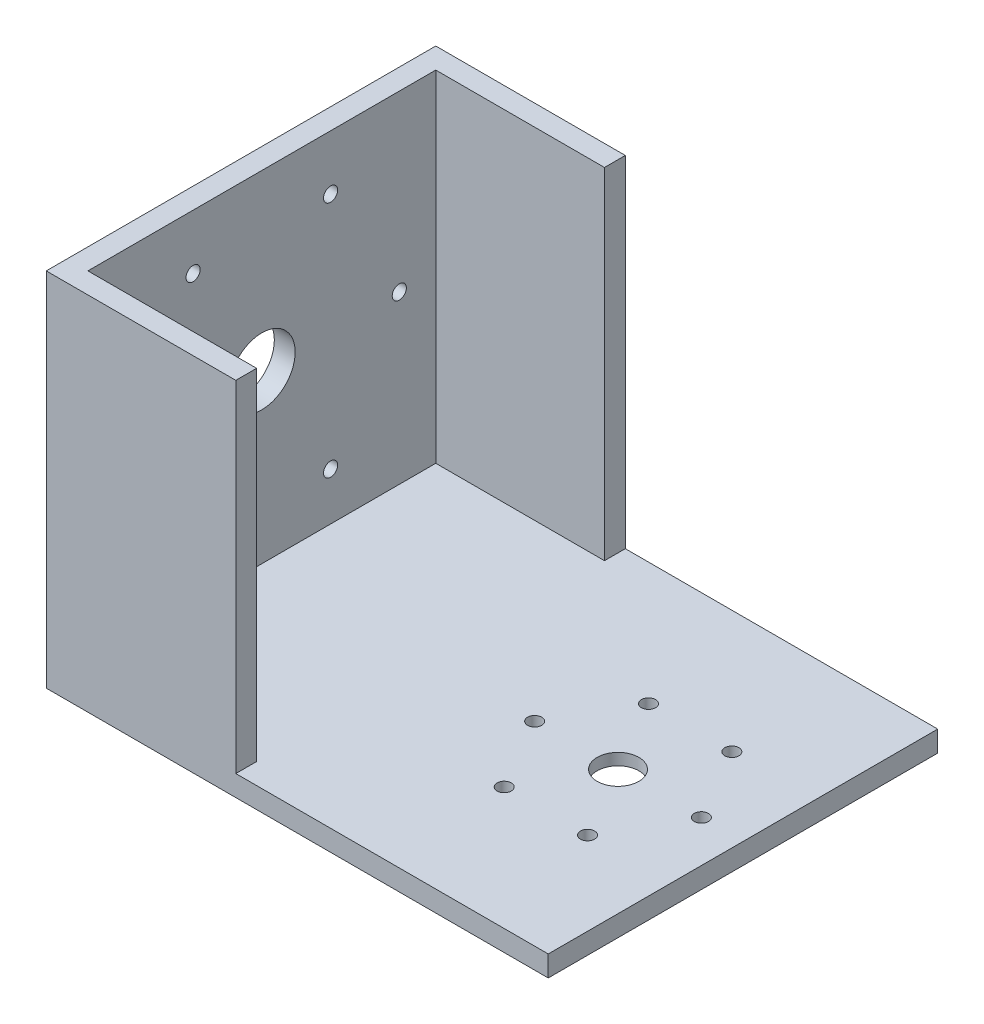
ISO-10303-21;
HEADER;
FILE_DESCRIPTION(('STEP AP214'),'2;1');
FILE_NAME('part.step','',(''),(''),'','','');
FILE_SCHEMA(('AUTOMOTIVE_DESIGN { 1 0 10303 214 1 1 1 1 }'));
ENDSEC;
DATA;
#1=APPLICATION_CONTEXT('core data for automotive mechanical design processes');
#2=APPLICATION_PROTOCOL_DEFINITION('international standard','automotive_design',2000,#1);
#3=PRODUCT_CONTEXT('',#1,'mechanical');
#4=PRODUCT('Part','Part','',(#3));
#5=PRODUCT_RELATED_PRODUCT_CATEGORY('part','',(#4));
#6=PRODUCT_DEFINITION_FORMATION('','',#4);
#7=PRODUCT_DEFINITION_CONTEXT('part definition',#1,'design');
#8=PRODUCT_DEFINITION('design','',#6,#7);
#9=PRODUCT_DEFINITION_SHAPE('','',#8);
#10=(LENGTH_UNIT() NAMED_UNIT(*) SI_UNIT(.MILLI.,.METRE.));
#11=(NAMED_UNIT(*) PLANE_ANGLE_UNIT() SI_UNIT($,.RADIAN.));
#12=(NAMED_UNIT(*) SI_UNIT($,.STERADIAN.) SOLID_ANGLE_UNIT());
#13=UNCERTAINTY_MEASURE_WITH_UNIT(LENGTH_MEASURE(1.E-05),#10,'distance_accuracy_value','');
#14=(GEOMETRIC_REPRESENTATION_CONTEXT(3) GLOBAL_UNCERTAINTY_ASSIGNED_CONTEXT((#13)) GLOBAL_UNIT_ASSIGNED_CONTEXT((#10,
#11,#12)) REPRESENTATION_CONTEXT('',''));
#15=CARTESIAN_POINT('',(0.,0.,0.));
#16=DIRECTION('',(0.,0.,1.));
#17=DIRECTION('',(1.,0.,0.));
#18=AXIS2_PLACEMENT_3D('',#15,#16,#17);
#19=CARTESIAN_POINT('',(0.,5.,0.));
#20=DIRECTION('',(0.,-1.,0.));
#21=DIRECTION('',(0.,0.,-1.));
#22=AXIS2_PLACEMENT_3D('',#19,#20,#21);
#23=PLANE('',#22);
#24=CARTESIAN_POINT('',(20.,5.,0.));
#25=DIRECTION('',(0.,1.,0.));
#26=DIRECTION('',(0.,0.,1.));
#27=AXIS2_PLACEMENT_3D('',#24,#25,#26);
#28=CIRCLE('',#27,1.7);
#29=CARTESIAN_POINT('',(20.,5.,1.7));
#30=VERTEX_POINT('',#29);
#31=EDGE_CURVE('E249',#30,#30,#28,.T.);
#32=ORIENTED_EDGE('',*,*,#31,.F.);
#33=EDGE_LOOP('',(#32));
#34=FACE_BOUND('',#33,.T.);
#35=CARTESIAN_POINT('',(10.,5.,-17.3205080756888));
#36=DIRECTION('',(0.,1.,0.));
#37=DIRECTION('',(0.,0.,1.));
#38=AXIS2_PLACEMENT_3D('',#35,#36,#37);
#39=CIRCLE('',#38,1.7);
#40=CARTESIAN_POINT('',(10.,5.,-15.6205080756888));
#41=VERTEX_POINT('',#40);
#42=EDGE_CURVE('E243',#41,#41,#39,.T.);
#43=ORIENTED_EDGE('',*,*,#42,.F.);
#44=EDGE_LOOP('',(#43));
#45=FACE_BOUND('',#44,.T.);
#46=CARTESIAN_POINT('',(-9.99999999999999,5.,-17.3205080756888));
#47=DIRECTION('',(0.,1.,0.));
#48=DIRECTION('',(0.,0.,1.));
#49=AXIS2_PLACEMENT_3D('',#46,#47,#48);
#50=CIRCLE('',#49,1.7);
#51=CARTESIAN_POINT('',(-9.99999999999999,5.,-15.6205080756888));
#52=VERTEX_POINT('',#51);
#53=EDGE_CURVE('E236',#52,#52,#50,.T.);
#54=ORIENTED_EDGE('',*,*,#53,.F.);
#55=EDGE_LOOP('',(#54));
#56=FACE_BOUND('',#55,.T.);
#57=CARTESIAN_POINT('',(-20.,5.,0.));
#58=DIRECTION('',(0.,1.,0.));
#59=DIRECTION('',(0.,0.,1.));
#60=AXIS2_PLACEMENT_3D('',#57,#58,#59);
#61=CIRCLE('',#60,1.7);
#62=CARTESIAN_POINT('',(-20.,5.,1.7));
#63=VERTEX_POINT('',#62);
#64=EDGE_CURVE('E235',#63,#63,#61,.T.);
#65=ORIENTED_EDGE('',*,*,#64,.F.);
#66=EDGE_LOOP('',(#65));
#67=FACE_BOUND('',#66,.T.);
#68=CARTESIAN_POINT('',(-10.,5.,17.3205080756888));
#69=DIRECTION('',(0.,1.,0.));
#70=DIRECTION('',(0.,0.,1.));
#71=AXIS2_PLACEMENT_3D('',#68,#69,#70);
#72=CIRCLE('',#71,1.7);
#73=CARTESIAN_POINT('',(-10.,5.,19.0205080756888));
#74=VERTEX_POINT('',#73);
#75=EDGE_CURVE('E226',#74,#74,#72,.T.);
#76=ORIENTED_EDGE('',*,*,#75,.F.);
#77=EDGE_LOOP('',(#76));
#78=FACE_BOUND('',#77,.T.);
#79=CARTESIAN_POINT('',(10.,5.,17.3205080756888));
#80=DIRECTION('',(0.,1.,0.));
#81=DIRECTION('',(0.,0.,1.));
#82=AXIS2_PLACEMENT_3D('',#79,#80,#81);
#83=CIRCLE('',#82,1.7);
#84=CARTESIAN_POINT('',(10.,5.,19.0205080756888));
#85=VERTEX_POINT('',#84);
#86=EDGE_CURVE('E219',#85,#85,#83,.T.);
#87=ORIENTED_EDGE('',*,*,#86,.F.);
#88=EDGE_LOOP('',(#87));
#89=FACE_BOUND('',#88,.T.);
#90=CARTESIAN_POINT('',(0.,5.,0.));
#91=DIRECTION('',(0.,1.,0.));
#92=DIRECTION('',(0.,0.,1.));
#93=AXIS2_PLACEMENT_3D('',#90,#91,#92);
#94=CIRCLE('',#93,5.);
#95=CARTESIAN_POINT('',(0.,5.,5.));
#96=VERTEX_POINT('',#95);
#97=EDGE_CURVE('E216',#96,#96,#94,.T.);
#98=ORIENTED_EDGE('',*,*,#97,.F.);
#99=EDGE_LOOP('',(#98));
#100=FACE_BOUND('',#99,.T.);
#101=DIRECTION('',(0.,0.,-1.));
#102=VECTOR('',#101,1.);
#103=CARTESIAN_POINT('',(-45.,5.,0.));
#104=LINE('',#103,#102);
#105=CARTESIAN_POINT('',(-45.,5.,-41.75));
#106=VERTEX_POINT('',#105);
#107=CARTESIAN_POINT('',(-45.,5.,-46.75));
#108=VERTEX_POINT('',#107);
#109=EDGE_CURVE('E53',#106,#108,#104,.T.);
#110=ORIENTED_EDGE('',*,*,#109,.F.);
#111=DIRECTION('',(-1.,0.,0.));
#112=VECTOR('',#111,1.);
#113=CARTESIAN_POINT('',(0.,5.,-41.75));
#114=LINE('',#113,#112);
#115=CARTESIAN_POINT('',(-85.5,5.,-41.75));
#116=VERTEX_POINT('',#115);
#117=EDGE_CURVE('E121',#106,#116,#114,.T.);
#118=ORIENTED_EDGE('',*,*,#117,.T.);
#119=DIRECTION('',(0.,0.,1.));
#120=VECTOR('',#119,1.);
#121=CARTESIAN_POINT('',(-85.5,5.,0.));
#122=LINE('',#121,#120);
#123=CARTESIAN_POINT('',(-85.5,5.,41.75));
#124=VERTEX_POINT('',#123);
#125=EDGE_CURVE('E50',#116,#124,#122,.T.);
#126=ORIENTED_EDGE('',*,*,#125,.T.);
#127=DIRECTION('',(-1.,0.,0.));
#128=VECTOR('',#127,1.);
#129=CARTESIAN_POINT('',(0.,5.,41.75));
#130=LINE('',#129,#128);
#131=CARTESIAN_POINT('',(-45.,5.,41.75));
#132=VERTEX_POINT('',#131);
#133=EDGE_CURVE('E152',#132,#124,#130,.T.);
#134=ORIENTED_EDGE('',*,*,#133,.F.);
#135=DIRECTION('',(0.,0.,-1.));
#136=VECTOR('',#135,1.);
#137=CARTESIAN_POINT('',(-45.,5.,0.));
#138=LINE('',#137,#136);
#139=CARTESIAN_POINT('',(-45.,5.,46.75));
#140=VERTEX_POINT('',#139);
#141=EDGE_CURVE('E160',#140,#132,#138,.T.);
#142=ORIENTED_EDGE('',*,*,#141,.F.);
#143=DIRECTION('',(1.,0.,0.));
#144=VECTOR('',#143,1.);
#145=CARTESIAN_POINT('',(30.,5.,46.75));
#146=LINE('',#145,#144);
#147=CARTESIAN_POINT('',(30.,5.,46.75));
#148=VERTEX_POINT('',#147);
#149=EDGE_CURVE('E258',#140,#148,#146,.T.);
#150=ORIENTED_EDGE('',*,*,#149,.T.);
#151=DIRECTION('',(0.,0.,-1.));
#152=VECTOR('',#151,1.);
#153=CARTESIAN_POINT('',(30.,5.,-46.75));
#154=LINE('',#153,#152);
#155=CARTESIAN_POINT('',(30.,5.,-46.75));
#156=VERTEX_POINT('',#155);
#157=EDGE_CURVE('E256',#148,#156,#154,.T.);
#158=ORIENTED_EDGE('',*,*,#157,.T.);
#159=DIRECTION('',(-1.,0.,0.));
#160=VECTOR('',#159,1.);
#161=CARTESIAN_POINT('',(-90.5,5.,-46.75));
#162=LINE('',#161,#160);
#163=EDGE_CURVE('E56',#156,#108,#162,.T.);
#164=ORIENTED_EDGE('',*,*,#163,.T.);
#165=EDGE_LOOP('',(#110,#118,#126,#134,#142,#150,#158,#164));
#166=FACE_BOUND('',#165,.T.);
#167=ADVANCED_FACE('F39',(#34,#45,#56,#67,#78,#89,#100,#166),#23,.F.);
#168=CARTESIAN_POINT('',(-85.5,0.,0.));
#169=DIRECTION('',(1.,0.,0.));
#170=DIRECTION('',(0.,0.,-1.));
#171=AXIS2_PLACEMENT_3D('',#168,#169,#170);
#172=PLANE('',#171);
#173=DIRECTION('',(0.,-1.,0.));
#174=VECTOR('',#173,1.);
#175=CARTESIAN_POINT('',(-85.5,0.,-41.75));
#176=LINE('',#175,#174);
#177=CARTESIAN_POINT('',(-85.5,86.75,-41.75));
#178=VERTEX_POINT('',#177);
#179=EDGE_CURVE('E135',#178,#116,#176,.T.);
#180=ORIENTED_EDGE('',*,*,#179,.F.);
#181=DIRECTION('',(0.,0.,1.));
#182=VECTOR('',#181,1.);
#183=CARTESIAN_POINT('',(-85.5,86.75,-46.75));
#184=LINE('',#183,#182);
#185=CARTESIAN_POINT('',(-85.5,86.75,41.75));
#186=VERTEX_POINT('',#185);
#187=EDGE_CURVE('E140',#178,#186,#184,.T.);
#188=ORIENTED_EDGE('',*,*,#187,.T.);
#189=DIRECTION('',(0.,-1.,0.));
#190=VECTOR('',#189,1.);
#191=CARTESIAN_POINT('',(-85.5,0.,41.75));
#192=LINE('',#191,#190);
#193=EDGE_CURVE('E11',#186,#124,#192,.T.);
#194=ORIENTED_EDGE('',*,*,#193,.T.);
#195=ORIENTED_EDGE('',*,*,#125,.F.);
#196=EDGE_LOOP('',(#180,#188,#194,#195));
#197=FACE_BOUND('',#196,.T.);
#198=CARTESIAN_POINT('',(-85.5,16.4211616751135,-16.5));
#199=DIRECTION('',(1.,0.,0.));
#200=DIRECTION('',(0.,0.,-1.));
#201=AXIS2_PLACEMENT_3D('',#198,#199,#200);
#202=CIRCLE('',#201,1.7);
#203=CARTESIAN_POINT('',(-85.5,16.4211616751135,-18.2));
#204=VERTEX_POINT('',#203);
#205=EDGE_CURVE('E159',#204,#204,#202,.T.);
#206=ORIENTED_EDGE('',*,*,#205,.F.);
#207=EDGE_LOOP('',(#206));
#208=FACE_BOUND('',#207,.T.);
#209=CARTESIAN_POINT('',(-85.5,45.,33.));
#210=DIRECTION('',(1.,0.,0.));
#211=DIRECTION('',(0.,0.,-1.));
#212=AXIS2_PLACEMENT_3D('',#209,#210,#211);
#213=CIRCLE('',#212,1.7);
#214=CARTESIAN_POINT('',(-85.5,45.,31.3));
#215=VERTEX_POINT('',#214);
#216=EDGE_CURVE('E175',#215,#215,#213,.T.);
#217=ORIENTED_EDGE('',*,*,#216,.F.);
#218=EDGE_LOOP('',(#217));
#219=FACE_BOUND('',#218,.T.);
#220=CARTESIAN_POINT('',(-85.5,73.5788383248865,-16.5));
#221=DIRECTION('',(1.,0.,0.));
#222=DIRECTION('',(0.,0.,-1.));
#223=AXIS2_PLACEMENT_3D('',#220,#221,#222);
#224=CIRCLE('',#223,1.7);
#225=CARTESIAN_POINT('',(-85.5,73.5788383248865,-18.2));
#226=VERTEX_POINT('',#225);
#227=EDGE_CURVE('E184',#226,#226,#224,.T.);
#228=ORIENTED_EDGE('',*,*,#227,.F.);
#229=EDGE_LOOP('',(#228));
#230=FACE_BOUND('',#229,.T.);
#231=CARTESIAN_POINT('',(-85.5,45.,0.));
#232=DIRECTION('',(1.,0.,0.));
#233=DIRECTION('',(0.,0.,-1.));
#234=AXIS2_PLACEMENT_3D('',#231,#232,#233);
#235=CIRCLE('',#234,8.);
#236=CARTESIAN_POINT('',(-85.5,45.,-8.));
#237=VERTEX_POINT('',#236);
#238=EDGE_CURVE('E198',#237,#237,#235,.T.);
#239=ORIENTED_EDGE('',*,*,#238,.F.);
#240=EDGE_LOOP('',(#239));
#241=FACE_BOUND('',#240,.T.);
#242=CARTESIAN_POINT('',(-85.5,45.,-33.));
#243=DIRECTION('',(1.,0.,0.));
#244=DIRECTION('',(0.,0.,-1.));
#245=AXIS2_PLACEMENT_3D('',#242,#243,#244);
#246=CIRCLE('',#245,1.7);
#247=CARTESIAN_POINT('',(-85.5,45.,-34.7));
#248=VERTEX_POINT('',#247);
#249=EDGE_CURVE('E189',#248,#248,#246,.T.);
#250=ORIENTED_EDGE('',*,*,#249,.F.);
#251=EDGE_LOOP('',(#250));
#252=FACE_BOUND('',#251,.T.);
#253=CARTESIAN_POINT('',(-85.5,73.5788383248865,16.5));
#254=DIRECTION('',(1.,0.,0.));
#255=DIRECTION('',(0.,0.,-1.));
#256=AXIS2_PLACEMENT_3D('',#253,#254,#255);
#257=CIRCLE('',#256,1.7);
#258=CARTESIAN_POINT('',(-85.5,73.5788383248865,14.8));
#259=VERTEX_POINT('',#258);
#260=EDGE_CURVE('E177',#259,#259,#257,.T.);
#261=ORIENTED_EDGE('',*,*,#260,.F.);
#262=EDGE_LOOP('',(#261));
#263=FACE_BOUND('',#262,.T.);
#264=CARTESIAN_POINT('',(-85.5,16.4211616751135,16.5));
#265=DIRECTION('',(1.,0.,0.));
#266=DIRECTION('',(0.,0.,-1.));
#267=AXIS2_PLACEMENT_3D('',#264,#265,#266);
#268=CIRCLE('',#267,1.7);
#269=CARTESIAN_POINT('',(-85.5,16.4211616751135,14.8));
#270=VERTEX_POINT('',#269);
#271=EDGE_CURVE('E167',#270,#270,#268,.T.);
#272=ORIENTED_EDGE('',*,*,#271,.F.);
#273=EDGE_LOOP('',(#272));
#274=FACE_BOUND('',#273,.T.);
#275=ADVANCED_FACE('F288',(#197,#208,#219,#230,#241,#252,#263,#274),#172,.T.);
#276=CARTESIAN_POINT('',(0.,0.,0.));
#277=DIRECTION('',(0.,-1.,0.));
#278=DIRECTION('',(0.,0.,-1.));
#279=AXIS2_PLACEMENT_3D('',#276,#277,#278);
#280=PLANE('',#279);
#281=DIRECTION('',(0.,0.,1.));
#282=VECTOR('',#281,1.);
#283=CARTESIAN_POINT('',(-90.5,0.,46.75));
#284=LINE('',#283,#282);
#285=CARTESIAN_POINT('',(-90.5,0.,-46.75));
#286=VERTEX_POINT('',#285);
#287=CARTESIAN_POINT('',(-90.5,0.,46.75));
#288=VERTEX_POINT('',#287);
#289=EDGE_CURVE('E251',#286,#288,#284,.T.);
#290=ORIENTED_EDGE('',*,*,#289,.F.);
#291=DIRECTION('',(-1.,0.,0.));
#292=VECTOR('',#291,1.);
#293=CARTESIAN_POINT('',(-90.5,0.,-46.75));
#294=LINE('',#293,#292);
#295=CARTESIAN_POINT('',(30.,0.,-46.75));
#296=VERTEX_POINT('',#295);
#297=EDGE_CURVE('E259',#296,#286,#294,.T.);
#298=ORIENTED_EDGE('',*,*,#297,.F.);
#299=DIRECTION('',(0.,0.,-1.));
#300=VECTOR('',#299,1.);
#301=CARTESIAN_POINT('',(30.,0.,-46.75));
#302=LINE('',#301,#300);
#303=CARTESIAN_POINT('',(30.,0.,46.75));
#304=VERTEX_POINT('',#303);
#305=EDGE_CURVE('E266',#304,#296,#302,.T.);
#306=ORIENTED_EDGE('',*,*,#305,.F.);
#307=DIRECTION('',(1.,0.,0.));
#308=VECTOR('',#307,1.);
#309=CARTESIAN_POINT('',(30.,0.,46.75));
#310=LINE('',#309,#308);
#311=EDGE_CURVE('E262',#288,#304,#310,.T.);
#312=ORIENTED_EDGE('',*,*,#311,.F.);
#313=EDGE_LOOP('',(#290,#298,#306,#312));
#314=FACE_BOUND('',#313,.T.);
#315=CARTESIAN_POINT('',(0.,0.,0.));
#316=DIRECTION('',(0.,1.,0.));
#317=DIRECTION('',(0.,0.,1.));
#318=AXIS2_PLACEMENT_3D('',#315,#316,#317);
#319=CIRCLE('',#318,15.15);
#320=CARTESIAN_POINT('',(0.,0.,15.15));
#321=VERTEX_POINT('',#320);
#322=EDGE_CURVE('E207',#321,#321,#319,.T.);
#323=ORIENTED_EDGE('',*,*,#322,.T.);
#324=EDGE_LOOP('',(#323));
#325=FACE_BOUND('',#324,.T.);
#326=CARTESIAN_POINT('',(10.,0.,17.3205080756888));
#327=DIRECTION('',(0.,1.,0.));
#328=DIRECTION('',(0.,0.,1.));
#329=AXIS2_PLACEMENT_3D('',#326,#327,#328);
#330=CIRCLE('',#329,1.7);
#331=CARTESIAN_POINT('',(10.,0.,19.0205080756888));
#332=VERTEX_POINT('',#331);
#333=EDGE_CURVE('E218',#332,#332,#330,.T.);
#334=ORIENTED_EDGE('',*,*,#333,.T.);
#335=EDGE_LOOP('',(#334));
#336=FACE_BOUND('',#335,.T.);
#337=CARTESIAN_POINT('',(-20.,0.,0.));
#338=DIRECTION('',(0.,1.,0.));
#339=DIRECTION('',(0.,0.,1.));
#340=AXIS2_PLACEMENT_3D('',#337,#338,#339);
#341=CIRCLE('',#340,1.7);
#342=CARTESIAN_POINT('',(-20.,0.,1.7));
#343=VERTEX_POINT('',#342);
#344=EDGE_CURVE('E228',#343,#343,#341,.T.);
#345=ORIENTED_EDGE('',*,*,#344,.T.);
#346=EDGE_LOOP('',(#345));
#347=FACE_BOUND('',#346,.T.);
#348=CARTESIAN_POINT('',(10.,0.,-17.3205080756888));
#349=DIRECTION('',(0.,1.,0.));
#350=DIRECTION('',(0.,0.,1.));
#351=AXIS2_PLACEMENT_3D('',#348,#349,#350);
#352=CIRCLE('',#351,1.7);
#353=CARTESIAN_POINT('',(10.,0.,-15.6205080756888));
#354=VERTEX_POINT('',#353);
#355=EDGE_CURVE('E241',#354,#354,#352,.T.);
#356=ORIENTED_EDGE('',*,*,#355,.T.);
#357=EDGE_LOOP('',(#356));
#358=FACE_BOUND('',#357,.T.);
#359=CARTESIAN_POINT('',(20.,0.,0.));
#360=DIRECTION('',(0.,1.,0.));
#361=DIRECTION('',(0.,0.,1.));
#362=AXIS2_PLACEMENT_3D('',#359,#360,#361);
#363=CIRCLE('',#362,1.7);
#364=CARTESIAN_POINT('',(20.,0.,1.7));
#365=VERTEX_POINT('',#364);
#366=EDGE_CURVE('E250',#365,#365,#363,.T.);
#367=ORIENTED_EDGE('',*,*,#366,.T.);
#368=EDGE_LOOP('',(#367));
#369=FACE_BOUND('',#368,.T.);
#370=CARTESIAN_POINT('',(-9.99999999999999,0.,-17.3205080756888));
#371=DIRECTION('',(0.,1.,0.));
#372=DIRECTION('',(0.,0.,1.));
#373=AXIS2_PLACEMENT_3D('',#370,#371,#372);
#374=CIRCLE('',#373,1.7);
#375=CARTESIAN_POINT('',(-9.99999999999999,0.,-15.6205080756888));
#376=VERTEX_POINT('',#375);
#377=EDGE_CURVE('E234',#376,#376,#374,.T.);
#378=ORIENTED_EDGE('',*,*,#377,.T.);
#379=EDGE_LOOP('',(#378));
#380=FACE_BOUND('',#379,.T.);
#381=CARTESIAN_POINT('',(-10.,0.,17.3205080756888));
#382=DIRECTION('',(0.,1.,0.));
#383=DIRECTION('',(0.,0.,1.));
#384=AXIS2_PLACEMENT_3D('',#381,#382,#383);
#385=CIRCLE('',#384,1.7);
#386=CARTESIAN_POINT('',(-10.,0.,19.0205080756888));
#387=VERTEX_POINT('',#386);
#388=EDGE_CURVE('E224',#387,#387,#385,.T.);
#389=ORIENTED_EDGE('',*,*,#388,.T.);
#390=EDGE_LOOP('',(#389));
#391=FACE_BOUND('',#390,.T.);
#392=ADVANCED_FACE('F295',(#314,#325,#336,#347,#358,#369,#380,#391),#280,.T.);
#393=CARTESIAN_POINT('',(-90.5,5.,46.75));
#394=DIRECTION('',(1.,0.,0.));
#395=DIRECTION('',(0.,0.,-1.));
#396=AXIS2_PLACEMENT_3D('',#393,#394,#395);
#397=PLANE('',#396);
#398=DIRECTION('',(0.,-1.,0.));
#399=VECTOR('',#398,1.);
#400=CARTESIAN_POINT('',(-90.5,5.,46.75));
#401=LINE('',#400,#399);
#402=CARTESIAN_POINT('',(-90.5,86.75,46.75));
#403=VERTEX_POINT('',#402);
#404=EDGE_CURVE('E280',#403,#288,#401,.T.);
#405=ORIENTED_EDGE('',*,*,#404,.F.);
#406=DIRECTION('',(0.,0.,1.));
#407=VECTOR('',#406,1.);
#408=CARTESIAN_POINT('',(-90.5,86.75,-46.75));
#409=LINE('',#408,#407);
#410=CARTESIAN_POINT('',(-90.5,86.75,-46.75));
#411=VERTEX_POINT('',#410);
#412=EDGE_CURVE('E200',#411,#403,#409,.T.);
#413=ORIENTED_EDGE('',*,*,#412,.F.);
#414=DIRECTION('',(0.,-1.,0.));
#415=VECTOR('',#414,1.);
#416=CARTESIAN_POINT('',(-90.5,5.,-46.75));
#417=LINE('',#416,#415);
#418=EDGE_CURVE('E265',#411,#286,#417,.T.);
#419=ORIENTED_EDGE('',*,*,#418,.T.);
#420=ORIENTED_EDGE('',*,*,#289,.T.);
#421=EDGE_LOOP('',(#405,#413,#419,#420));
#422=FACE_BOUND('',#421,.T.);
#423=CARTESIAN_POINT('',(-90.5,16.4211616751135,-16.5));
#424=DIRECTION('',(1.,0.,0.));
#425=DIRECTION('',(0.,0.,-1.));
#426=AXIS2_PLACEMENT_3D('',#423,#424,#425);
#427=CIRCLE('',#426,1.7);
#428=CARTESIAN_POINT('',(-90.5,16.4211616751135,-18.2));
#429=VERTEX_POINT('',#428);
#430=EDGE_CURVE('E157',#429,#429,#427,.T.);
#431=ORIENTED_EDGE('',*,*,#430,.T.);
#432=EDGE_LOOP('',(#431));
#433=FACE_BOUND('',#432,.T.);
#434=CARTESIAN_POINT('',(-90.5,16.4211616751135,16.5));
#435=DIRECTION('',(1.,0.,0.));
#436=DIRECTION('',(0.,0.,-1.));
#437=AXIS2_PLACEMENT_3D('',#434,#435,#436);
#438=CIRCLE('',#437,1.7);
#439=CARTESIAN_POINT('',(-90.5,16.4211616751135,14.8));
#440=VERTEX_POINT('',#439);
#441=EDGE_CURVE('E162',#440,#440,#438,.T.);
#442=ORIENTED_EDGE('',*,*,#441,.T.);
#443=EDGE_LOOP('',(#442));
#444=FACE_BOUND('',#443,.T.);
#445=CARTESIAN_POINT('',(-90.5,45.,33.));
#446=DIRECTION('',(1.,0.,0.));
#447=DIRECTION('',(0.,0.,-1.));
#448=AXIS2_PLACEMENT_3D('',#445,#446,#447);
#449=CIRCLE('',#448,1.7);
#450=CARTESIAN_POINT('',(-90.5,45.,31.3));
#451=VERTEX_POINT('',#450);
#452=EDGE_CURVE('E166',#451,#451,#449,.T.);
#453=ORIENTED_EDGE('',*,*,#452,.T.);
#454=EDGE_LOOP('',(#453));
#455=FACE_BOUND('',#454,.T.);
#456=CARTESIAN_POINT('',(-90.5,73.5788383248865,16.5));
#457=DIRECTION('',(1.,0.,0.));
#458=DIRECTION('',(0.,0.,-1.));
#459=AXIS2_PLACEMENT_3D('',#456,#457,#458);
#460=CIRCLE('',#459,1.7);
#461=CARTESIAN_POINT('',(-90.5,73.5788383248865,14.8));
#462=VERTEX_POINT('',#461);
#463=EDGE_CURVE('E174',#462,#462,#460,.T.);
#464=ORIENTED_EDGE('',*,*,#463,.T.);
#465=EDGE_LOOP('',(#464));
#466=FACE_BOUND('',#465,.T.);
#467=CARTESIAN_POINT('',(-90.5,73.5788383248865,-16.5));
#468=DIRECTION('',(1.,0.,0.));
#469=DIRECTION('',(0.,0.,-1.));
#470=AXIS2_PLACEMENT_3D('',#467,#468,#469);
#471=CIRCLE('',#470,1.7);
#472=CARTESIAN_POINT('',(-90.5,73.5788383248865,-18.2));
#473=VERTEX_POINT('',#472);
#474=EDGE_CURVE('E182',#473,#473,#471,.T.);
#475=ORIENTED_EDGE('',*,*,#474,.T.);
#476=EDGE_LOOP('',(#475));
#477=FACE_BOUND('',#476,.T.);
#478=CARTESIAN_POINT('',(-90.5,45.,-33.));
#479=DIRECTION('',(1.,0.,0.));
#480=DIRECTION('',(0.,0.,-1.));
#481=AXIS2_PLACEMENT_3D('',#478,#479,#480);
#482=CIRCLE('',#481,1.7);
#483=CARTESIAN_POINT('',(-90.5,45.,-34.7));
#484=VERTEX_POINT('',#483);
#485=EDGE_CURVE('E190',#484,#484,#482,.T.);
#486=ORIENTED_EDGE('',*,*,#485,.T.);
#487=EDGE_LOOP('',(#486));
#488=FACE_BOUND('',#487,.T.);
#489=CARTESIAN_POINT('',(-90.5,45.,0.));
#490=DIRECTION('',(1.,0.,0.));
#491=DIRECTION('',(0.,0.,-1.));
#492=AXIS2_PLACEMENT_3D('',#489,#490,#491);
#493=CIRCLE('',#492,8.);
#494=CARTESIAN_POINT('',(-90.5,45.,-8.));
#495=VERTEX_POINT('',#494);
#496=EDGE_CURVE('E192',#495,#495,#493,.T.);
#497=ORIENTED_EDGE('',*,*,#496,.T.);
#498=EDGE_LOOP('',(#497));
#499=FACE_BOUND('',#498,.T.);
#500=ADVANCED_FACE('F41',(#422,#433,#444,#455,#466,#477,#488,#499),#397,.F.);
#501=CARTESIAN_POINT('',(30.,5.,46.75));
#502=DIRECTION('',(0.,0.,-1.));
#503=DIRECTION('',(-1.,0.,0.));
#504=AXIS2_PLACEMENT_3D('',#501,#502,#503);
#505=PLANE('',#504);
#506=ORIENTED_EDGE('',*,*,#149,.F.);
#507=DIRECTION('',(0.,1.,0.));
#508=VECTOR('',#507,1.);
#509=CARTESIAN_POINT('',(-45.,0.,46.75));
#510=LINE('',#509,#508);
#511=CARTESIAN_POINT('',(-45.,86.75,46.75));
#512=VERTEX_POINT('',#511);
#513=EDGE_CURVE('E144',#140,#512,#510,.T.);
#514=ORIENTED_EDGE('',*,*,#513,.T.);
#515=DIRECTION('',(-1.,0.,0.));
#516=VECTOR('',#515,1.);
#517=CARTESIAN_POINT('',(-85.5,86.75,46.75));
#518=LINE('',#517,#516);
#519=EDGE_CURVE('E201',#512,#403,#518,.T.);
#520=ORIENTED_EDGE('',*,*,#519,.T.);
#521=ORIENTED_EDGE('',*,*,#404,.T.);
#522=ORIENTED_EDGE('',*,*,#311,.T.);
#523=DIRECTION('',(0.,-1.,0.));
#524=VECTOR('',#523,1.);
#525=CARTESIAN_POINT('',(30.,5.,46.75));
#526=LINE('',#525,#524);
#527=EDGE_CURVE('E273',#148,#304,#526,.T.);
#528=ORIENTED_EDGE('',*,*,#527,.F.);
#529=EDGE_LOOP('',(#506,#514,#520,#521,#522,#528));
#530=FACE_BOUND('',#529,.T.);
#531=ADVANCED_FACE('F318',(#530),#505,.F.);
#532=CARTESIAN_POINT('',(30.,5.,-46.75));
#533=DIRECTION('',(-1.,0.,0.));
#534=DIRECTION('',(0.,0.,1.));
#535=AXIS2_PLACEMENT_3D('',#532,#533,#534);
#536=PLANE('',#535);
#537=ORIENTED_EDGE('',*,*,#305,.T.);
#538=DIRECTION('',(0.,-1.,0.));
#539=VECTOR('',#538,1.);
#540=CARTESIAN_POINT('',(30.,5.,-46.75));
#541=LINE('',#540,#539);
#542=EDGE_CURVE('E271',#156,#296,#541,.T.);
#543=ORIENTED_EDGE('',*,*,#542,.F.);
#544=ORIENTED_EDGE('',*,*,#157,.F.);
#545=ORIENTED_EDGE('',*,*,#527,.T.);
#546=EDGE_LOOP('',(#537,#543,#544,#545));
#547=FACE_BOUND('',#546,.T.);
#548=ADVANCED_FACE('F361',(#547),#536,.F.);
#549=CARTESIAN_POINT('',(-90.5,5.,-46.75));
#550=DIRECTION('',(0.,0.,1.));
#551=DIRECTION('',(1.,0.,0.));
#552=AXIS2_PLACEMENT_3D('',#549,#550,#551);
#553=PLANE('',#552);
#554=DIRECTION('',(-1.,0.,0.));
#555=VECTOR('',#554,1.);
#556=CARTESIAN_POINT('',(-85.5,86.75,-46.75));
#557=LINE('',#556,#555);
#558=CARTESIAN_POINT('',(-45.,86.75,-46.75));
#559=VERTEX_POINT('',#558);
#560=EDGE_CURVE('E210',#559,#411,#557,.T.);
#561=ORIENTED_EDGE('',*,*,#560,.F.);
#562=DIRECTION('',(0.,1.,0.));
#563=VECTOR('',#562,1.);
#564=CARTESIAN_POINT('',(-45.,0.,-46.75));
#565=LINE('',#564,#563);
#566=EDGE_CURVE('E122',#108,#559,#565,.T.);
#567=ORIENTED_EDGE('',*,*,#566,.F.);
#568=ORIENTED_EDGE('',*,*,#163,.F.);
#569=ORIENTED_EDGE('',*,*,#542,.T.);
#570=ORIENTED_EDGE('',*,*,#297,.T.);
#571=ORIENTED_EDGE('',*,*,#418,.F.);
#572=EDGE_LOOP('',(#561,#567,#568,#569,#570,#571));
#573=FACE_BOUND('',#572,.T.);
#574=ADVANCED_FACE('F359',(#573),#553,.F.);
#575=CARTESIAN_POINT('',(20.,5.,0.));
#576=DIRECTION('',(0.,-1.,0.));
#577=DIRECTION('',(0.,0.,-1.));
#578=AXIS2_PLACEMENT_3D('',#575,#576,#577);
#579=CYLINDRICAL_SURFACE('',#578,1.7);
#580=ORIENTED_EDGE('',*,*,#31,.T.);
#581=EDGE_LOOP('',(#580));
#582=FACE_BOUND('',#581,.T.);
#583=ORIENTED_EDGE('',*,*,#366,.F.);
#584=EDGE_LOOP('',(#583));
#585=FACE_BOUND('',#584,.T.);
#586=ADVANCED_FACE('F354',(#582,#585),#579,.F.);
#587=CARTESIAN_POINT('',(10.,5.,-17.3205080756888));
#588=DIRECTION('',(0.,-1.,0.));
#589=DIRECTION('',(0.,0.,-1.));
#590=AXIS2_PLACEMENT_3D('',#587,#588,#589);
#591=CYLINDRICAL_SURFACE('',#590,1.7);
#592=ORIENTED_EDGE('',*,*,#42,.T.);
#593=EDGE_LOOP('',(#592));
#594=FACE_BOUND('',#593,.T.);
#595=ORIENTED_EDGE('',*,*,#355,.F.);
#596=EDGE_LOOP('',(#595));
#597=FACE_BOUND('',#596,.T.);
#598=ADVANCED_FACE('F423',(#594,#597),#591,.F.);
#599=CARTESIAN_POINT('',(-9.99999999999999,5.,-17.3205080756888));
#600=DIRECTION('',(0.,-1.,0.));
#601=DIRECTION('',(0.,0.,-1.));
#602=AXIS2_PLACEMENT_3D('',#599,#600,#601);
#603=CYLINDRICAL_SURFACE('',#602,1.7);
#604=ORIENTED_EDGE('',*,*,#53,.T.);
#605=EDGE_LOOP('',(#604));
#606=FACE_BOUND('',#605,.T.);
#607=ORIENTED_EDGE('',*,*,#377,.F.);
#608=EDGE_LOOP('',(#607));
#609=FACE_BOUND('',#608,.T.);
#610=ADVANCED_FACE('F414',(#606,#609),#603,.F.);
#611=CARTESIAN_POINT('',(-20.,5.,0.));
#612=DIRECTION('',(0.,-1.,0.));
#613=DIRECTION('',(0.,0.,-1.));
#614=AXIS2_PLACEMENT_3D('',#611,#612,#613);
#615=CYLINDRICAL_SURFACE('',#614,1.7);
#616=ORIENTED_EDGE('',*,*,#64,.T.);
#617=EDGE_LOOP('',(#616));
#618=FACE_BOUND('',#617,.T.);
#619=ORIENTED_EDGE('',*,*,#344,.F.);
#620=EDGE_LOOP('',(#619));
#621=FACE_BOUND('',#620,.T.);
#622=ADVANCED_FACE('F403',(#618,#621),#615,.F.);
#623=CARTESIAN_POINT('',(-10.,5.,17.3205080756888));
#624=DIRECTION('',(0.,-1.,0.));
#625=DIRECTION('',(0.,0.,-1.));
#626=AXIS2_PLACEMENT_3D('',#623,#624,#625);
#627=CYLINDRICAL_SURFACE('',#626,1.7);
#628=ORIENTED_EDGE('',*,*,#75,.T.);
#629=EDGE_LOOP('',(#628));
#630=FACE_BOUND('',#629,.T.);
#631=ORIENTED_EDGE('',*,*,#388,.F.);
#632=EDGE_LOOP('',(#631));
#633=FACE_BOUND('',#632,.T.);
#634=ADVANCED_FACE('F405',(#630,#633),#627,.F.);
#635=CARTESIAN_POINT('',(10.,5.,17.3205080756888));
#636=DIRECTION('',(0.,-1.,0.));
#637=DIRECTION('',(0.,0.,-1.));
#638=AXIS2_PLACEMENT_3D('',#635,#636,#637);
#639=CYLINDRICAL_SURFACE('',#638,1.7);
#640=ORIENTED_EDGE('',*,*,#86,.T.);
#641=EDGE_LOOP('',(#640));
#642=FACE_BOUND('',#641,.T.);
#643=ORIENTED_EDGE('',*,*,#333,.F.);
#644=EDGE_LOOP('',(#643));
#645=FACE_BOUND('',#644,.T.);
#646=ADVANCED_FACE('F404',(#642,#645),#639,.F.);
#647=CARTESIAN_POINT('',(0.,5.,0.));
#648=DIRECTION('',(0.,-1.,0.));
#649=DIRECTION('',(0.,0.,-1.));
#650=AXIS2_PLACEMENT_3D('',#647,#648,#649);
#651=CYLINDRICAL_SURFACE('',#650,5.);
#652=CARTESIAN_POINT('',(0.,2.2,0.));
#653=DIRECTION('',(0.,1.,0.));
#654=DIRECTION('',(0.,0.,1.));
#655=AXIS2_PLACEMENT_3D('',#652,#653,#654);
#656=CIRCLE('',#655,5.);
#657=CARTESIAN_POINT('',(0.,2.2,5.));
#658=VERTEX_POINT('',#657);
#659=EDGE_CURVE('E213',#658,#658,#656,.T.);
#660=ORIENTED_EDGE('',*,*,#659,.F.);
#661=EDGE_LOOP('',(#660));
#662=FACE_BOUND('',#661,.T.);
#663=ORIENTED_EDGE('',*,*,#97,.T.);
#664=EDGE_LOOP('',(#663));
#665=FACE_BOUND('',#664,.T.);
#666=ADVANCED_FACE('F415',(#662,#665),#651,.F.);
#667=CARTESIAN_POINT('',(0.,2.2,0.));
#668=DIRECTION('',(0.,-1.,0.));
#669=DIRECTION('',(0.,0.,-1.));
#670=AXIS2_PLACEMENT_3D('',#667,#668,#669);
#671=CYLINDRICAL_SURFACE('',#670,15.15);
#672=CARTESIAN_POINT('',(0.,2.2,0.));
#673=DIRECTION('',(0.,1.,0.));
#674=DIRECTION('',(0.,0.,1.));
#675=AXIS2_PLACEMENT_3D('',#672,#673,#674);
#676=CIRCLE('',#675,15.15);
#677=CARTESIAN_POINT('',(0.,2.2,15.15));
#678=VERTEX_POINT('',#677);
#679=EDGE_CURVE('E209',#678,#678,#676,.T.);
#680=ORIENTED_EDGE('',*,*,#679,.T.);
#681=EDGE_LOOP('',(#680));
#682=FACE_BOUND('',#681,.T.);
#683=ORIENTED_EDGE('',*,*,#322,.F.);
#684=EDGE_LOOP('',(#683));
#685=FACE_BOUND('',#684,.T.);
#686=ADVANCED_FACE('F444',(#682,#685),#671,.F.);
#687=CARTESIAN_POINT('',(0.,2.2,0.));
#688=DIRECTION('',(0.,1.,0.));
#689=DIRECTION('',(0.,0.,1.));
#690=AXIS2_PLACEMENT_3D('',#687,#688,#689);
#691=PLANE('',#690);
#692=ORIENTED_EDGE('',*,*,#659,.T.);
#693=EDGE_LOOP('',(#692));
#694=FACE_BOUND('',#693,.T.);
#695=ORIENTED_EDGE('',*,*,#679,.F.);
#696=EDGE_LOOP('',(#695));
#697=FACE_BOUND('',#696,.T.);
#698=ADVANCED_FACE('F342',(#694,#697),#691,.F.);
#699=CARTESIAN_POINT('',(-85.5,86.75,-46.75));
#700=DIRECTION('',(0.,-1.,0.));
#701=DIRECTION('',(0.,0.,-1.));
#702=AXIS2_PLACEMENT_3D('',#699,#700,#701);
#703=PLANE('',#702);
#704=ORIENTED_EDGE('',*,*,#187,.F.);
#705=DIRECTION('',(-1.,0.,0.));
#706=VECTOR('',#705,1.);
#707=CARTESIAN_POINT('',(-45.,86.75,-41.75));
#708=LINE('',#707,#706);
#709=CARTESIAN_POINT('',(-45.,86.75,-41.75));
#710=VERTEX_POINT('',#709);
#711=EDGE_CURVE('E119',#710,#178,#708,.T.);
#712=ORIENTED_EDGE('',*,*,#711,.F.);
#713=DIRECTION('',(0.,0.,-1.));
#714=VECTOR('',#713,1.);
#715=CARTESIAN_POINT('',(-45.,86.75,-41.75));
#716=LINE('',#715,#714);
#717=EDGE_CURVE('E130',#710,#559,#716,.T.);
#718=ORIENTED_EDGE('',*,*,#717,.T.);
#719=ORIENTED_EDGE('',*,*,#560,.T.);
#720=ORIENTED_EDGE('',*,*,#412,.T.);
#721=ORIENTED_EDGE('',*,*,#519,.F.);
#722=DIRECTION('',(0.,0.,-1.));
#723=VECTOR('',#722,1.);
#724=CARTESIAN_POINT('',(-45.,86.75,46.75));
#725=LINE('',#724,#723);
#726=CARTESIAN_POINT('',(-45.,86.75,41.75));
#727=VERTEX_POINT('',#726);
#728=EDGE_CURVE('E146',#512,#727,#725,.T.);
#729=ORIENTED_EDGE('',*,*,#728,.T.);
#730=DIRECTION('',(-1.,0.,0.));
#731=VECTOR('',#730,1.);
#732=CARTESIAN_POINT('',(-45.,86.75,41.75));
#733=LINE('',#732,#731);
#734=EDGE_CURVE('E149',#727,#186,#733,.T.);
#735=ORIENTED_EDGE('',*,*,#734,.T.);
#736=EDGE_LOOP('',(#704,#712,#718,#719,#720,#721,#729,#735));
#737=FACE_BOUND('',#736,.T.);
#738=ADVANCED_FACE('F134',(#737),#703,.F.);
#739=CARTESIAN_POINT('',(-85.5,45.,0.));
#740=DIRECTION('',(-1.,0.,0.));
#741=DIRECTION('',(0.,0.,1.));
#742=AXIS2_PLACEMENT_3D('',#739,#740,#741);
#743=CYLINDRICAL_SURFACE('',#742,8.);
#744=ORIENTED_EDGE('',*,*,#238,.T.);
#745=EDGE_LOOP('',(#744));
#746=FACE_BOUND('',#745,.T.);
#747=ORIENTED_EDGE('',*,*,#496,.F.);
#748=EDGE_LOOP('',(#747));
#749=FACE_BOUND('',#748,.T.);
#750=ADVANCED_FACE('F329',(#746,#749),#743,.F.);
#751=CARTESIAN_POINT('',(-85.5,45.,-33.));
#752=DIRECTION('',(-1.,0.,0.));
#753=DIRECTION('',(0.,0.,1.));
#754=AXIS2_PLACEMENT_3D('',#751,#752,#753);
#755=CYLINDRICAL_SURFACE('',#754,1.7);
#756=ORIENTED_EDGE('',*,*,#249,.T.);
#757=EDGE_LOOP('',(#756));
#758=FACE_BOUND('',#757,.T.);
#759=ORIENTED_EDGE('',*,*,#485,.F.);
#760=EDGE_LOOP('',(#759));
#761=FACE_BOUND('',#760,.T.);
#762=ADVANCED_FACE('F335',(#758,#761),#755,.F.);
#763=CARTESIAN_POINT('',(-85.5,73.5788383248865,-16.5));
#764=DIRECTION('',(-1.,0.,0.));
#765=DIRECTION('',(0.,0.,1.));
#766=AXIS2_PLACEMENT_3D('',#763,#764,#765);
#767=CYLINDRICAL_SURFACE('',#766,1.7);
#768=ORIENTED_EDGE('',*,*,#227,.T.);
#769=EDGE_LOOP('',(#768));
#770=FACE_BOUND('',#769,.T.);
#771=ORIENTED_EDGE('',*,*,#474,.F.);
#772=EDGE_LOOP('',(#771));
#773=FACE_BOUND('',#772,.T.);
#774=ADVANCED_FACE('F338',(#770,#773),#767,.F.);
#775=CARTESIAN_POINT('',(-85.5,73.5788383248865,16.5));
#776=DIRECTION('',(-1.,0.,0.));
#777=DIRECTION('',(0.,0.,1.));
#778=AXIS2_PLACEMENT_3D('',#775,#776,#777);
#779=CYLINDRICAL_SURFACE('',#778,1.7);
#780=ORIENTED_EDGE('',*,*,#260,.T.);
#781=EDGE_LOOP('',(#780));
#782=FACE_BOUND('',#781,.T.);
#783=ORIENTED_EDGE('',*,*,#463,.F.);
#784=EDGE_LOOP('',(#783));
#785=FACE_BOUND('',#784,.T.);
#786=ADVANCED_FACE('F604',(#782,#785),#779,.F.);
#787=CARTESIAN_POINT('',(-85.5,45.,33.));
#788=DIRECTION('',(-1.,0.,0.));
#789=DIRECTION('',(0.,0.,1.));
#790=AXIS2_PLACEMENT_3D('',#787,#788,#789);
#791=CYLINDRICAL_SURFACE('',#790,1.7);
#792=ORIENTED_EDGE('',*,*,#216,.T.);
#793=EDGE_LOOP('',(#792));
#794=FACE_BOUND('',#793,.T.);
#795=ORIENTED_EDGE('',*,*,#452,.F.);
#796=EDGE_LOOP('',(#795));
#797=FACE_BOUND('',#796,.T.);
#798=ADVANCED_FACE('F315',(#794,#797),#791,.F.);
#799=CARTESIAN_POINT('',(-85.5,16.4211616751135,16.5));
#800=DIRECTION('',(-1.,0.,0.));
#801=DIRECTION('',(0.,0.,1.));
#802=AXIS2_PLACEMENT_3D('',#799,#800,#801);
#803=CYLINDRICAL_SURFACE('',#802,1.7);
#804=ORIENTED_EDGE('',*,*,#271,.T.);
#805=EDGE_LOOP('',(#804));
#806=FACE_BOUND('',#805,.T.);
#807=ORIENTED_EDGE('',*,*,#441,.F.);
#808=EDGE_LOOP('',(#807));
#809=FACE_BOUND('',#808,.T.);
#810=ADVANCED_FACE('F306',(#806,#809),#803,.F.);
#811=CARTESIAN_POINT('',(-85.5,16.4211616751135,-16.5));
#812=DIRECTION('',(-1.,0.,0.));
#813=DIRECTION('',(0.,0.,1.));
#814=AXIS2_PLACEMENT_3D('',#811,#812,#813);
#815=CYLINDRICAL_SURFACE('',#814,1.7);
#816=ORIENTED_EDGE('',*,*,#205,.T.);
#817=EDGE_LOOP('',(#816));
#818=FACE_BOUND('',#817,.T.);
#819=ORIENTED_EDGE('',*,*,#430,.F.);
#820=EDGE_LOOP('',(#819));
#821=FACE_BOUND('',#820,.T.);
#822=ADVANCED_FACE('F313',(#818,#821),#815,.F.);
#823=CARTESIAN_POINT('',(-45.,0.,46.75));
#824=DIRECTION('',(-1.,0.,0.));
#825=DIRECTION('',(0.,0.,1.));
#826=AXIS2_PLACEMENT_3D('',#823,#824,#825);
#827=PLANE('',#826);
#828=ORIENTED_EDGE('',*,*,#513,.F.);
#829=ORIENTED_EDGE('',*,*,#141,.T.);
#830=DIRECTION('',(0.,1.,0.));
#831=VECTOR('',#830,1.);
#832=CARTESIAN_POINT('',(-45.,0.,41.75));
#833=LINE('',#832,#831);
#834=EDGE_CURVE('E145',#132,#727,#833,.T.);
#835=ORIENTED_EDGE('',*,*,#834,.T.);
#836=ORIENTED_EDGE('',*,*,#728,.F.);
#837=EDGE_LOOP('',(#828,#829,#835,#836));
#838=FACE_BOUND('',#837,.T.);
#839=ADVANCED_FACE('F377',(#838),#827,.F.);
#840=CARTESIAN_POINT('',(0.,0.,41.75));
#841=DIRECTION('',(0.,0.,1.));
#842=DIRECTION('',(1.,0.,0.));
#843=AXIS2_PLACEMENT_3D('',#840,#841,#842);
#844=PLANE('',#843);
#845=ORIENTED_EDGE('',*,*,#834,.F.);
#846=ORIENTED_EDGE('',*,*,#133,.T.);
#847=ORIENTED_EDGE('',*,*,#193,.F.);
#848=ORIENTED_EDGE('',*,*,#734,.F.);
#849=EDGE_LOOP('',(#845,#846,#847,#848));
#850=FACE_BOUND('',#849,.T.);
#851=ADVANCED_FACE('F290',(#850),#844,.F.);
#852=CARTESIAN_POINT('',(-45.,0.,-41.75));
#853=DIRECTION('',(-1.,0.,0.));
#854=DIRECTION('',(0.,0.,1.));
#855=AXIS2_PLACEMENT_3D('',#852,#853,#854);
#856=PLANE('',#855);
#857=DIRECTION('',(0.,1.,0.));
#858=VECTOR('',#857,1.);
#859=CARTESIAN_POINT('',(-45.,0.,-41.75));
#860=LINE('',#859,#858);
#861=EDGE_CURVE('E113',#106,#710,#860,.T.);
#862=ORIENTED_EDGE('',*,*,#861,.F.);
#863=ORIENTED_EDGE('',*,*,#109,.T.);
#864=ORIENTED_EDGE('',*,*,#566,.T.);
#865=ORIENTED_EDGE('',*,*,#717,.F.);
#866=EDGE_LOOP('',(#862,#863,#864,#865));
#867=FACE_BOUND('',#866,.T.);
#868=ADVANCED_FACE('F126',(#867),#856,.F.);
#869=CARTESIAN_POINT('',(0.,0.,-41.75));
#870=DIRECTION('',(0.,0.,1.));
#871=DIRECTION('',(1.,0.,0.));
#872=AXIS2_PLACEMENT_3D('',#869,#870,#871);
#873=PLANE('',#872);
#874=ORIENTED_EDGE('',*,*,#117,.F.);
#875=ORIENTED_EDGE('',*,*,#861,.T.);
#876=ORIENTED_EDGE('',*,*,#711,.T.);
#877=ORIENTED_EDGE('',*,*,#179,.T.);
#878=EDGE_LOOP('',(#874,#875,#876,#877));
#879=FACE_BOUND('',#878,.T.);
#880=ADVANCED_FACE('F120',(#879),#873,.T.);
#881=CLOSED_SHELL('',(#167,#275,#392,#500,#531,#548,#574,#586,#598,#610,#622,#634,#646,#666,
#686,#698,#738,#750,#762,#774,#786,#798,#810,#822,#839,#851,#868,#880));
#882=MANIFOLD_SOLID_BREP('B2',#881);
#883=ADVANCED_BREP_SHAPE_REPRESENTATION('',(#18,#882),#14);
#884=SHAPE_DEFINITION_REPRESENTATION(#9,#883);
ENDSEC;
END-ISO-10303-21;
